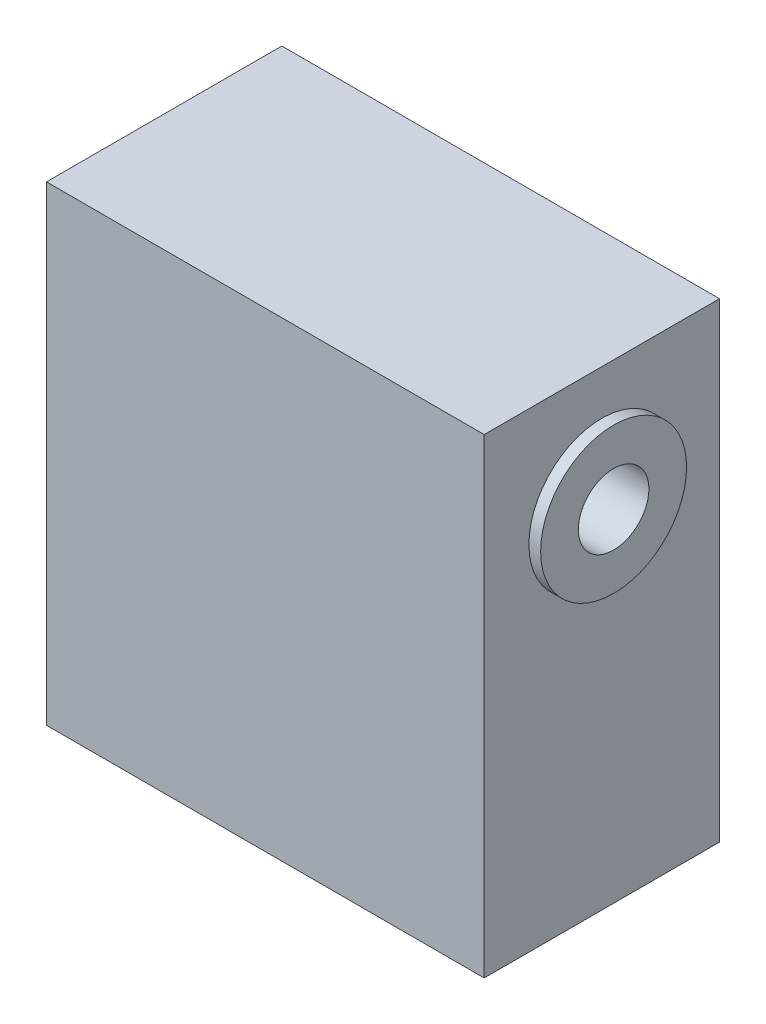
ISO-10303-21;
HEADER;
FILE_DESCRIPTION(('STEP AP214'),'2;1');
FILE_NAME('part.step','',(''),(''),'','','');
FILE_SCHEMA(('AUTOMOTIVE_DESIGN { 1 0 10303 214 1 1 1 1 }'));
ENDSEC;
DATA;
#1=APPLICATION_CONTEXT('core data for automotive mechanical design processes');
#2=APPLICATION_PROTOCOL_DEFINITION('international standard','automotive_design',2000,#1);
#3=PRODUCT_CONTEXT('',#1,'mechanical');
#4=PRODUCT('Part','Part','',(#3));
#5=PRODUCT_RELATED_PRODUCT_CATEGORY('part','',(#4));
#6=PRODUCT_DEFINITION_FORMATION('','',#4);
#7=PRODUCT_DEFINITION_CONTEXT('part definition',#1,'design');
#8=PRODUCT_DEFINITION('design','',#6,#7);
#9=PRODUCT_DEFINITION_SHAPE('','',#8);
#10=(LENGTH_UNIT() NAMED_UNIT(*) SI_UNIT(.MILLI.,.METRE.));
#11=(NAMED_UNIT(*) PLANE_ANGLE_UNIT() SI_UNIT($,.RADIAN.));
#12=(NAMED_UNIT(*) SI_UNIT($,.STERADIAN.) SOLID_ANGLE_UNIT());
#13=UNCERTAINTY_MEASURE_WITH_UNIT(LENGTH_MEASURE(1.E-05),#10,'distance_accuracy_value','');
#14=(GEOMETRIC_REPRESENTATION_CONTEXT(3) GLOBAL_UNCERTAINTY_ASSIGNED_CONTEXT((#13)) GLOBAL_UNIT_ASSIGNED_CONTEXT((#10,
#11,#12)) REPRESENTATION_CONTEXT('',''));
#15=CARTESIAN_POINT('',(0.,0.,0.));
#16=DIRECTION('',(0.,0.,1.));
#17=DIRECTION('',(1.,0.,0.));
#18=AXIS2_PLACEMENT_3D('',#15,#16,#17);
#19=CARTESIAN_POINT('',(0.,40.,0.));
#20=DIRECTION('',(-1.,0.,0.));
#21=DIRECTION('',(0.,0.,1.));
#22=AXIS2_PLACEMENT_3D('',#19,#20,#21);
#23=PLANE('',#22);
#24=CARTESIAN_POINT('',(0.,30.,-10.));
#25=DIRECTION('',(-1.,0.,0.));
#26=DIRECTION('',(0.,0.,1.));
#27=AXIS2_PLACEMENT_3D('',#24,#25,#26);
#28=CIRCLE('',#27,6.20000000000001);
#29=CARTESIAN_POINT('',(0.,30.,-3.79999999999999));
#30=VERTEX_POINT('',#29);
#31=EDGE_CURVE('E11',#30,#30,#28,.F.);
#32=ORIENTED_EDGE('',*,*,#31,.F.);
#33=EDGE_LOOP('',(#32));
#34=FACE_BOUND('',#33,.T.);
#35=DIRECTION('',(0.,0.,-1.));
#36=VECTOR('',#35,1.);
#37=CARTESIAN_POINT('',(0.,0.,0.));
#38=LINE('',#37,#36);
#39=CARTESIAN_POINT('',(0.,0.,0.));
#40=VERTEX_POINT('',#39);
#41=CARTESIAN_POINT('',(0.,0.,-20.));
#42=VERTEX_POINT('',#41);
#43=EDGE_CURVE('E106',#40,#42,#38,.T.);
#44=ORIENTED_EDGE('',*,*,#43,.T.);
#45=DIRECTION('',(0.,-1.,0.));
#46=VECTOR('',#45,1.);
#47=CARTESIAN_POINT('',(0.,40.,-20.));
#48=LINE('',#47,#46);
#49=CARTESIAN_POINT('',(0.,40.,-20.));
#50=VERTEX_POINT('',#49);
#51=EDGE_CURVE('E48',#50,#42,#48,.T.);
#52=ORIENTED_EDGE('',*,*,#51,.F.);
#53=DIRECTION('',(0.,0.,-1.));
#54=VECTOR('',#53,1.);
#55=CARTESIAN_POINT('',(0.,40.,0.));
#56=LINE('',#55,#54);
#57=CARTESIAN_POINT('',(0.,40.,0.));
#58=VERTEX_POINT('',#57);
#59=EDGE_CURVE('E92',#58,#50,#56,.T.);
#60=ORIENTED_EDGE('',*,*,#59,.F.);
#61=DIRECTION('',(0.,-1.,0.));
#62=VECTOR('',#61,1.);
#63=CARTESIAN_POINT('',(0.,40.,0.));
#64=LINE('',#63,#62);
#65=EDGE_CURVE('E102',#58,#40,#64,.T.);
#66=ORIENTED_EDGE('',*,*,#65,.T.);
#67=EDGE_LOOP('',(#44,#52,#60,#66));
#68=FACE_BOUND('',#67,.T.);
#69=ADVANCED_FACE('F40',(#34,#68),#23,.F.);
#70=CARTESIAN_POINT('',(0.,40.,-20.));
#71=DIRECTION('',(0.,0.,1.));
#72=DIRECTION('',(1.,0.,0.));
#73=AXIS2_PLACEMENT_3D('',#70,#71,#72);
#74=PLANE('',#73);
#75=DIRECTION('',(-1.,0.,0.));
#76=VECTOR('',#75,1.);
#77=CARTESIAN_POINT('',(0.,0.,-20.));
#78=LINE('',#77,#76);
#79=CARTESIAN_POINT('',(-37.2,0.,-20.));
#80=VERTEX_POINT('',#79);
#81=EDGE_CURVE('E97',#42,#80,#78,.T.);
#82=ORIENTED_EDGE('',*,*,#81,.T.);
#83=DIRECTION('',(0.,-1.,0.));
#84=VECTOR('',#83,1.);
#85=CARTESIAN_POINT('',(-37.2,40.,-20.));
#86=LINE('',#85,#84);
#87=CARTESIAN_POINT('',(-37.2,40.,-20.));
#88=VERTEX_POINT('',#87);
#89=EDGE_CURVE('E95',#88,#80,#86,.T.);
#90=ORIENTED_EDGE('',*,*,#89,.F.);
#91=DIRECTION('',(-1.,0.,0.));
#92=VECTOR('',#91,1.);
#93=CARTESIAN_POINT('',(0.,40.,-20.));
#94=LINE('',#93,#92);
#95=EDGE_CURVE('E87',#50,#88,#94,.T.);
#96=ORIENTED_EDGE('',*,*,#95,.F.);
#97=ORIENTED_EDGE('',*,*,#51,.T.);
#98=EDGE_LOOP('',(#82,#90,#96,#97));
#99=FACE_BOUND('',#98,.T.);
#100=ADVANCED_FACE('F96',(#99),#74,.F.);
#101=CARTESIAN_POINT('',(-37.2,40.,0.));
#102=DIRECTION('',(1.,0.,0.));
#103=DIRECTION('',(0.,0.,-1.));
#104=AXIS2_PLACEMENT_3D('',#101,#102,#103);
#105=PLANE('',#104);
#106=DIRECTION('',(0.,0.,1.));
#107=VECTOR('',#106,1.);
#108=CARTESIAN_POINT('',(-37.2,0.,0.));
#109=LINE('',#108,#107);
#110=CARTESIAN_POINT('',(-37.2,0.,0.));
#111=VERTEX_POINT('',#110);
#112=EDGE_CURVE('E73',#80,#111,#109,.T.);
#113=ORIENTED_EDGE('',*,*,#112,.T.);
#114=DIRECTION('',(0.,-1.,0.));
#115=VECTOR('',#114,1.);
#116=CARTESIAN_POINT('',(-37.2,40.,0.));
#117=LINE('',#116,#115);
#118=CARTESIAN_POINT('',(-37.2,40.,0.));
#119=VERTEX_POINT('',#118);
#120=EDGE_CURVE('E98',#119,#111,#117,.T.);
#121=ORIENTED_EDGE('',*,*,#120,.F.);
#122=DIRECTION('',(0.,0.,1.));
#123=VECTOR('',#122,1.);
#124=CARTESIAN_POINT('',(-37.2,40.,0.));
#125=LINE('',#124,#123);
#126=EDGE_CURVE('E90',#88,#119,#125,.T.);
#127=ORIENTED_EDGE('',*,*,#126,.F.);
#128=ORIENTED_EDGE('',*,*,#89,.T.);
#129=EDGE_LOOP('',(#113,#121,#127,#128));
#130=FACE_BOUND('',#129,.T.);
#131=ADVANCED_FACE('F100',(#130),#105,.F.);
#132=CARTESIAN_POINT('',(0.,40.,0.));
#133=DIRECTION('',(0.,0.,-1.));
#134=DIRECTION('',(-1.,0.,0.));
#135=AXIS2_PLACEMENT_3D('',#132,#133,#134);
#136=PLANE('',#135);
#137=DIRECTION('',(1.,0.,0.));
#138=VECTOR('',#137,1.);
#139=CARTESIAN_POINT('',(0.,0.,0.));
#140=LINE('',#139,#138);
#141=EDGE_CURVE('E79',#111,#40,#140,.T.);
#142=ORIENTED_EDGE('',*,*,#141,.T.);
#143=ORIENTED_EDGE('',*,*,#65,.F.);
#144=DIRECTION('',(1.,0.,0.));
#145=VECTOR('',#144,1.);
#146=CARTESIAN_POINT('',(0.,40.,0.));
#147=LINE('',#146,#145);
#148=EDGE_CURVE('E56',#119,#58,#147,.T.);
#149=ORIENTED_EDGE('',*,*,#148,.F.);
#150=ORIENTED_EDGE('',*,*,#120,.T.);
#151=EDGE_LOOP('',(#142,#143,#149,#150));
#152=FACE_BOUND('',#151,.T.);
#153=ADVANCED_FACE('F128',(#152),#136,.F.);
#154=CARTESIAN_POINT('',(0.,40.,0.));
#155=DIRECTION('',(0.,1.,0.));
#156=DIRECTION('',(0.,0.,1.));
#157=AXIS2_PLACEMENT_3D('',#154,#155,#156);
#158=PLANE('',#157);
#159=ORIENTED_EDGE('',*,*,#59,.T.);
#160=ORIENTED_EDGE('',*,*,#95,.T.);
#161=ORIENTED_EDGE('',*,*,#126,.T.);
#162=ORIENTED_EDGE('',*,*,#148,.T.);
#163=EDGE_LOOP('',(#159,#160,#161,#162));
#164=FACE_BOUND('',#163,.T.);
#165=ADVANCED_FACE('F88',(#164),#158,.T.);
#166=CARTESIAN_POINT('',(0.,0.,0.));
#167=DIRECTION('',(0.,1.,0.));
#168=DIRECTION('',(0.,0.,1.));
#169=AXIS2_PLACEMENT_3D('',#166,#167,#168);
#170=PLANE('',#169);
#171=ORIENTED_EDGE('',*,*,#43,.F.);
#172=ORIENTED_EDGE('',*,*,#141,.F.);
#173=ORIENTED_EDGE('',*,*,#112,.F.);
#174=ORIENTED_EDGE('',*,*,#81,.F.);
#175=EDGE_LOOP('',(#171,#172,#173,#174));
#176=FACE_BOUND('',#175,.T.);
#177=ADVANCED_FACE('F117',(#176),#170,.F.);
#178=CARTESIAN_POINT('',(1.,30.,-10.));
#179=DIRECTION('',(-1.,0.,0.));
#180=DIRECTION('',(0.,0.,1.));
#181=AXIS2_PLACEMENT_3D('',#178,#179,#180);
#182=CYLINDRICAL_SURFACE('',#181,6.20000000000001);
#183=CARTESIAN_POINT('',(1.,30.,-10.));
#184=DIRECTION('',(1.,0.,0.));
#185=DIRECTION('',(0.,0.,-1.));
#186=AXIS2_PLACEMENT_3D('',#183,#184,#185);
#187=CIRCLE('',#186,6.20000000000001);
#188=CARTESIAN_POINT('',(1.,30.,-16.2));
#189=VERTEX_POINT('',#188);
#190=EDGE_CURVE('E109',#189,#189,#187,.T.);
#191=ORIENTED_EDGE('',*,*,#190,.F.);
#192=EDGE_LOOP('',(#191));
#193=FACE_BOUND('',#192,.T.);
#194=ORIENTED_EDGE('',*,*,#31,.T.);
#195=EDGE_LOOP('',(#194));
#196=FACE_BOUND('',#195,.T.);
#197=ADVANCED_FACE('F119',(#193,#196),#182,.T.);
#198=CARTESIAN_POINT('',(1.,30.,-10.));
#199=DIRECTION('',(1.,0.,0.));
#200=DIRECTION('',(0.,0.,-1.));
#201=AXIS2_PLACEMENT_3D('',#198,#199,#200);
#202=PLANE('',#201);
#203=CARTESIAN_POINT('',(1.,30.,-10.));
#204=DIRECTION('',(1.,0.,0.));
#205=DIRECTION('',(0.,0.,-1.));
#206=AXIS2_PLACEMENT_3D('',#203,#204,#205);
#207=CIRCLE('',#206,3.);
#208=CARTESIAN_POINT('',(1.,30.,-13.));
#209=VERTEX_POINT('',#208);
#210=EDGE_CURVE('E203',#209,#209,#207,.T.);
#211=ORIENTED_EDGE('',*,*,#210,.F.);
#212=EDGE_LOOP('',(#211));
#213=FACE_BOUND('',#212,.T.);
#214=ORIENTED_EDGE('',*,*,#190,.T.);
#215=EDGE_LOOP('',(#214));
#216=FACE_BOUND('',#215,.T.);
#217=ADVANCED_FACE('F125',(#213,#216),#202,.T.);
#218=CARTESIAN_POINT('',(-9.,30.,-10.));
#219=DIRECTION('',(1.,0.,0.));
#220=DIRECTION('',(0.,0.,-1.));
#221=AXIS2_PLACEMENT_3D('',#218,#219,#220);
#222=CYLINDRICAL_SURFACE('',#221,3.);
#223=CARTESIAN_POINT('',(-9.,30.,-10.));
#224=DIRECTION('',(1.,0.,0.));
#225=DIRECTION('',(0.,0.,-1.));
#226=AXIS2_PLACEMENT_3D('',#223,#224,#225);
#227=CIRCLE('',#226,3.);
#228=CARTESIAN_POINT('',(-9.,30.,-13.));
#229=VERTEX_POINT('',#228);
#230=EDGE_CURVE('E202',#229,#229,#227,.T.);
#231=ORIENTED_EDGE('',*,*,#230,.F.);
#232=EDGE_LOOP('',(#231));
#233=FACE_BOUND('',#232,.T.);
#234=ORIENTED_EDGE('',*,*,#210,.T.);
#235=EDGE_LOOP('',(#234));
#236=FACE_BOUND('',#235,.T.);
#237=ADVANCED_FACE('F176',(#233,#236),#222,.F.);
#238=CARTESIAN_POINT('',(-9.,30.,-10.));
#239=DIRECTION('',(1.,0.,0.));
#240=DIRECTION('',(0.,0.,-1.));
#241=AXIS2_PLACEMENT_3D('',#238,#239,#240);
#242=PLANE('',#241);
#243=ORIENTED_EDGE('',*,*,#230,.T.);
#244=EDGE_LOOP('',(#243));
#245=FACE_BOUND('',#244,.T.);
#246=ADVANCED_FACE('F186',(#245),#242,.T.);
#247=CLOSED_SHELL('',(#69,#100,#131,#153,#165,#177,#197,#217,#237,#246));
#248=MANIFOLD_SOLID_BREP('B2',#247);
#249=ADVANCED_BREP_SHAPE_REPRESENTATION('',(#18,#248),#14);
#250=SHAPE_DEFINITION_REPRESENTATION(#9,#249);
ENDSEC;
END-ISO-10303-21;
